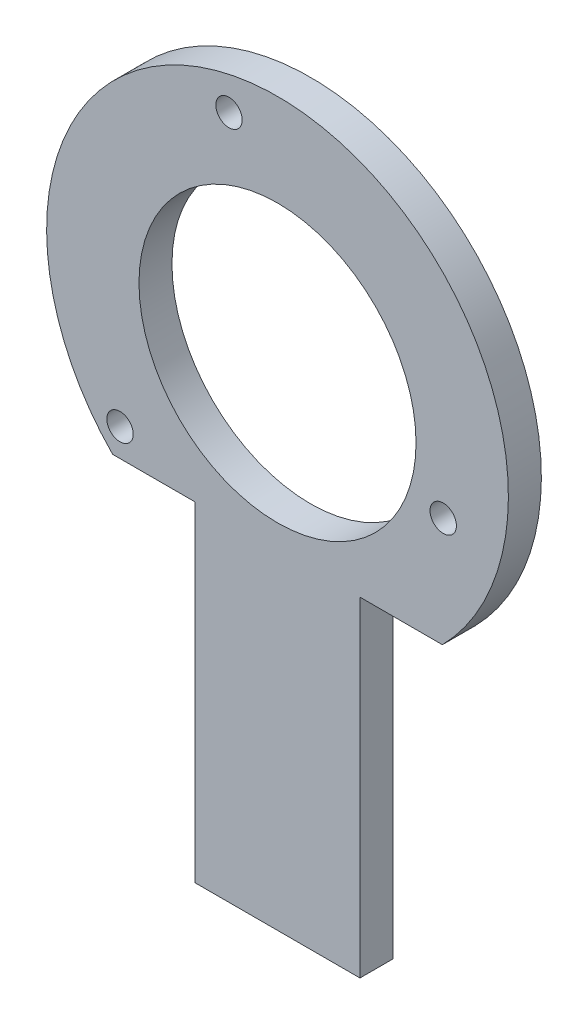
ISO-10303-21;
HEADER;
FILE_DESCRIPTION(('STEP AP214'),'2;1');
FILE_NAME('part.step','',(''),(''),'','','');
FILE_SCHEMA(('AUTOMOTIVE_DESIGN { 1 0 10303 214 1 1 1 1 }'));
ENDSEC;
DATA;
#1=APPLICATION_CONTEXT('core data for automotive mechanical design processes');
#2=APPLICATION_PROTOCOL_DEFINITION('international standard','automotive_design',2000,#1);
#3=PRODUCT_CONTEXT('',#1,'mechanical');
#4=PRODUCT('Part','Part','',(#3));
#5=PRODUCT_RELATED_PRODUCT_CATEGORY('part','',(#4));
#6=PRODUCT_DEFINITION_FORMATION('','',#4);
#7=PRODUCT_DEFINITION_CONTEXT('part definition',#1,'design');
#8=PRODUCT_DEFINITION('design','',#6,#7);
#9=PRODUCT_DEFINITION_SHAPE('','',#8);
#10=(LENGTH_UNIT() NAMED_UNIT(*) SI_UNIT(.MILLI.,.METRE.));
#11=(NAMED_UNIT(*) PLANE_ANGLE_UNIT() SI_UNIT($,.RADIAN.));
#12=(NAMED_UNIT(*) SI_UNIT($,.STERADIAN.) SOLID_ANGLE_UNIT());
#13=UNCERTAINTY_MEASURE_WITH_UNIT(LENGTH_MEASURE(1.E-05),#10,'distance_accuracy_value','');
#14=(GEOMETRIC_REPRESENTATION_CONTEXT(3) GLOBAL_UNCERTAINTY_ASSIGNED_CONTEXT((#13)) GLOBAL_UNIT_ASSIGNED_CONTEXT((#10,
#11,#12)) REPRESENTATION_CONTEXT('',''));
#15=CARTESIAN_POINT('',(0.,0.,0.));
#16=DIRECTION('',(0.,0.,1.));
#17=DIRECTION('',(1.,0.,0.));
#18=AXIS2_PLACEMENT_3D('',#15,#16,#17);
#19=CARTESIAN_POINT('',(-36.2560555223226,-24.892,0.));
#20=DIRECTION('',(0.,1.,0.));
#21=DIRECTION('',(0.,0.,1.));
#22=AXIS2_PLACEMENT_3D('',#19,#20,#21);
#23=PLANE('',#22);
#24=DIRECTION('',(0.,0.,1.));
#25=VECTOR('',#24,1.);
#26=CARTESIAN_POINT('',(12.7,-24.892,0.));
#27=LINE('',#26,#25);
#28=CARTESIAN_POINT('',(12.7,-24.892,0.));
#29=VERTEX_POINT('',#28);
#30=CARTESIAN_POINT('',(12.7,-24.892,5.08));
#31=VERTEX_POINT('',#30);
#32=EDGE_CURVE('E107',#29,#31,#27,.T.);
#33=ORIENTED_EDGE('',*,*,#32,.F.);
#34=DIRECTION('',(-1.,0.,0.));
#35=VECTOR('',#34,1.);
#36=CARTESIAN_POINT('',(0.,-24.8919999999999,0.));
#37=LINE('',#36,#35);
#38=CARTESIAN_POINT('',(25.3949194918984,-24.892,0.));
#39=VERTEX_POINT('',#38);
#40=EDGE_CURVE('E11',#39,#29,#37,.T.);
#41=ORIENTED_EDGE('',*,*,#40,.F.);
#42=DIRECTION('',(0.,0.,-1.));
#43=VECTOR('',#42,1.);
#44=CARTESIAN_POINT('',(25.3949194918984,-24.892,5.08));
#45=LINE('',#44,#43);
#46=CARTESIAN_POINT('',(25.3949194918984,-24.892,5.08));
#47=VERTEX_POINT('',#46);
#48=EDGE_CURVE('E143',#47,#39,#45,.T.);
#49=ORIENTED_EDGE('',*,*,#48,.F.);
#50=DIRECTION('',(-1.,0.,0.));
#51=VECTOR('',#50,1.);
#52=CARTESIAN_POINT('',(-36.2560555223226,-24.892,5.08));
#53=LINE('',#52,#51);
#54=EDGE_CURVE('E138',#47,#31,#53,.T.);
#55=ORIENTED_EDGE('',*,*,#54,.T.);
#56=EDGE_LOOP('',(#33,#41,#49,#55));
#57=FACE_BOUND('',#56,.T.);
#58=ADVANCED_FACE('F32',(#57),#23,.F.);
#59=DIRECTION('',(0.,0.,-1.));
#60=VECTOR('',#59,1.);
#61=CARTESIAN_POINT('',(-12.7,-24.892,0.));
#62=LINE('',#61,#60);
#63=CARTESIAN_POINT('',(-12.7,-24.892,5.08));
#64=VERTEX_POINT('',#63);
#65=CARTESIAN_POINT('',(-12.7,-24.892,0.));
#66=VERTEX_POINT('',#65);
#67=EDGE_CURVE('E103',#64,#66,#62,.T.);
#68=ORIENTED_EDGE('',*,*,#67,.F.);
#69=CARTESIAN_POINT('',(-25.3949194918984,-24.892,5.08));
#70=VERTEX_POINT('',#69);
#71=EDGE_CURVE('E123',#64,#70,#53,.T.);
#72=ORIENTED_EDGE('',*,*,#71,.T.);
#73=DIRECTION('',(0.,0.,-1.));
#74=VECTOR('',#73,1.);
#75=CARTESIAN_POINT('',(-25.3949194918984,-24.892,5.08));
#76=LINE('',#75,#74);
#77=CARTESIAN_POINT('',(-25.3949194918984,-24.892,0.));
#78=VERTEX_POINT('',#77);
#79=EDGE_CURVE('E140',#78,#70,#76,.F.);
#80=ORIENTED_EDGE('',*,*,#79,.F.);
#81=EDGE_CURVE('E40',#66,#78,#37,.T.);
#82=ORIENTED_EDGE('',*,*,#81,.F.);
#83=EDGE_LOOP('',(#68,#72,#80,#82));
#84=FACE_BOUND('',#83,.T.);
#85=ADVANCED_FACE('F164',(#84),#23,.F.);
#86=CARTESIAN_POINT('',(0.,0.,5.08));
#87=DIRECTION('',(0.,0.,-1.));
#88=DIRECTION('',(-1.,0.,0.));
#89=AXIS2_PLACEMENT_3D('',#86,#87,#88);
#90=CYLINDRICAL_SURFACE('',#89,35.56);
#91=CARTESIAN_POINT('',(0.,0.,5.08));
#92=DIRECTION('',(0.,0.,1.));
#93=DIRECTION('',(1.,0.,0.));
#94=AXIS2_PLACEMENT_3D('',#91,#92,#93);
#95=CIRCLE('',#94,35.56);
#96=EDGE_CURVE('E147',#47,#70,#95,.T.);
#97=ORIENTED_EDGE('',*,*,#96,.F.);
#98=ORIENTED_EDGE('',*,*,#48,.T.);
#99=CARTESIAN_POINT('',(0.,0.,0.));
#100=DIRECTION('',(0.,0.,1.));
#101=DIRECTION('',(1.,0.,0.));
#102=AXIS2_PLACEMENT_3D('',#99,#100,#101);
#103=CIRCLE('',#102,35.56);
#104=EDGE_CURVE('E146',#39,#78,#103,.T.);
#105=ORIENTED_EDGE('',*,*,#104,.T.);
#106=ORIENTED_EDGE('',*,*,#79,.T.);
#107=EDGE_LOOP('',(#97,#98,#105,#106));
#108=FACE_BOUND('',#107,.T.);
#109=ADVANCED_FACE('F34',(#108),#90,.T.);
#110=CARTESIAN_POINT('',(0.,0.,5.08));
#111=DIRECTION('',(0.,0.,1.));
#112=DIRECTION('',(1.,0.,0.));
#113=AXIS2_PLACEMENT_3D('',#110,#111,#112);
#114=PLANE('',#113);
#115=CARTESIAN_POINT('',(0.,0.,5.08));
#116=DIRECTION('',(0.,0.,-1.));
#117=DIRECTION('',(-1.,0.,0.));
#118=AXIS2_PLACEMENT_3D('',#115,#116,#117);
#119=CIRCLE('',#118,21.336);
#120=CARTESIAN_POINT('',(-21.336,0.,5.08));
#121=VERTEX_POINT('',#120);
#122=EDGE_CURVE('E112',#121,#121,#119,.T.);
#123=ORIENTED_EDGE('',*,*,#122,.T.);
#124=EDGE_LOOP('',(#123));
#125=FACE_BOUND('',#124,.T.);
#126=CARTESIAN_POINT('',(-24.2610998869317,-20.6264765028923,5.08));
#127=DIRECTION('',(0.,0.,1.));
#128=DIRECTION('',(1.,0.,0.));
#129=AXIS2_PLACEMENT_3D('',#126,#127,#128);
#130=CIRCLE('',#129,2.032);
#131=CARTESIAN_POINT('',(-22.2290998869317,-20.6264765028923,5.08));
#132=VERTEX_POINT('',#131);
#133=EDGE_CURVE('E124',#132,#132,#130,.T.);
#134=ORIENTED_EDGE('',*,*,#133,.F.);
#135=EDGE_LOOP('',(#134));
#136=FACE_BOUND('',#135,.T.);
#137=CARTESIAN_POINT('',(-7.47196911393405,29.6655234971076,5.08));
#138=DIRECTION('',(0.,0.,1.));
#139=DIRECTION('',(1.,0.,0.));
#140=AXIS2_PLACEMENT_3D('',#137,#138,#139);
#141=CIRCLE('',#140,2.032);
#142=CARTESIAN_POINT('',(-5.43996911393405,29.6655234971076,5.08));
#143=VERTEX_POINT('',#142);
#144=EDGE_CURVE('E130',#143,#143,#141,.T.);
#145=ORIENTED_EDGE('',*,*,#144,.F.);
#146=EDGE_LOOP('',(#145));
#147=FACE_BOUND('',#146,.T.);
#148=CARTESIAN_POINT('',(25.5229001130682,-7.95282373789202,5.08));
#149=DIRECTION('',(0.,0.,1.));
#150=DIRECTION('',(1.,0.,0.));
#151=AXIS2_PLACEMENT_3D('',#148,#149,#150);
#152=CIRCLE('',#151,2.032);
#153=CARTESIAN_POINT('',(27.5549001130682,-7.95282373789202,5.08));
#154=VERTEX_POINT('',#153);
#155=EDGE_CURVE('E118',#154,#154,#152,.T.);
#156=ORIENTED_EDGE('',*,*,#155,.F.);
#157=EDGE_LOOP('',(#156));
#158=FACE_BOUND('',#157,.T.);
#159=ORIENTED_EDGE('',*,*,#54,.F.);
#160=ORIENTED_EDGE('',*,*,#96,.T.);
#161=ORIENTED_EDGE('',*,*,#71,.F.);
#162=DIRECTION('',(0.,1.,0.));
#163=VECTOR('',#162,1.);
#164=CARTESIAN_POINT('',(-12.7,-75.692,5.08));
#165=LINE('',#164,#163);
#166=CARTESIAN_POINT('',(-12.7,-75.692,5.08));
#167=VERTEX_POINT('',#166);
#168=EDGE_CURVE('E92',#167,#64,#165,.T.);
#169=ORIENTED_EDGE('',*,*,#168,.F.);
#170=DIRECTION('',(-1.,0.,0.));
#171=VECTOR('',#170,1.);
#172=CARTESIAN_POINT('',(-12.7,-75.692,5.08));
#173=LINE('',#172,#171);
#174=CARTESIAN_POINT('',(12.7,-75.692,5.08));
#175=VERTEX_POINT('',#174);
#176=EDGE_CURVE('E84',#175,#167,#173,.T.);
#177=ORIENTED_EDGE('',*,*,#176,.F.);
#178=DIRECTION('',(0.,1.,0.));
#179=VECTOR('',#178,1.);
#180=CARTESIAN_POINT('',(12.7,-75.692,5.08));
#181=LINE('',#180,#179);
#182=EDGE_CURVE('E89',#175,#31,#181,.T.);
#183=ORIENTED_EDGE('',*,*,#182,.T.);
#184=EDGE_LOOP('',(#159,#160,#161,#169,#177,#183));
#185=FACE_BOUND('',#184,.T.);
#186=ADVANCED_FACE('F87',(#125,#136,#147,#158,#185),#114,.T.);
#187=CARTESIAN_POINT('',(0.,0.,0.));
#188=DIRECTION('',(0.,0.,1.));
#189=DIRECTION('',(1.,0.,0.));
#190=AXIS2_PLACEMENT_3D('',#187,#188,#189);
#191=PLANE('',#190);
#192=CARTESIAN_POINT('',(0.,0.,0.));
#193=DIRECTION('',(0.,0.,-1.));
#194=DIRECTION('',(-1.,0.,0.));
#195=AXIS2_PLACEMENT_3D('',#192,#193,#194);
#196=CIRCLE('',#195,21.336);
#197=CARTESIAN_POINT('',(-21.336,0.,0.));
#198=VERTEX_POINT('',#197);
#199=EDGE_CURVE('E109',#198,#198,#196,.T.);
#200=ORIENTED_EDGE('',*,*,#199,.F.);
#201=EDGE_LOOP('',(#200));
#202=FACE_BOUND('',#201,.T.);
#203=CARTESIAN_POINT('',(-24.2610998869317,-20.6264765028923,0.));
#204=DIRECTION('',(0.,0.,1.));
#205=DIRECTION('',(1.,0.,0.));
#206=AXIS2_PLACEMENT_3D('',#203,#204,#205);
#207=CIRCLE('',#206,2.032);
#208=CARTESIAN_POINT('',(-22.2290998869317,-20.6264765028923,0.));
#209=VERTEX_POINT('',#208);
#210=EDGE_CURVE('E120',#209,#209,#207,.T.);
#211=ORIENTED_EDGE('',*,*,#210,.T.);
#212=EDGE_LOOP('',(#211));
#213=FACE_BOUND('',#212,.T.);
#214=CARTESIAN_POINT('',(-7.47196911393405,29.6655234971076,0.));
#215=DIRECTION('',(0.,0.,1.));
#216=DIRECTION('',(1.,0.,0.));
#217=AXIS2_PLACEMENT_3D('',#214,#215,#216);
#218=CIRCLE('',#217,2.032);
#219=CARTESIAN_POINT('',(-5.43996911393405,29.6655234971076,0.));
#220=VERTEX_POINT('',#219);
#221=EDGE_CURVE('E127',#220,#220,#218,.T.);
#222=ORIENTED_EDGE('',*,*,#221,.T.);
#223=EDGE_LOOP('',(#222));
#224=FACE_BOUND('',#223,.T.);
#225=CARTESIAN_POINT('',(25.5229001130682,-7.95282373789202,0.));
#226=DIRECTION('',(0.,0.,1.));
#227=DIRECTION('',(1.,0.,0.));
#228=AXIS2_PLACEMENT_3D('',#225,#226,#227);
#229=CIRCLE('',#228,2.032);
#230=CARTESIAN_POINT('',(27.5549001130682,-7.95282373789202,0.));
#231=VERTEX_POINT('',#230);
#232=EDGE_CURVE('E133',#231,#231,#229,.T.);
#233=ORIENTED_EDGE('',*,*,#232,.T.);
#234=EDGE_LOOP('',(#233));
#235=FACE_BOUND('',#234,.T.);
#236=ORIENTED_EDGE('',*,*,#104,.F.);
#237=ORIENTED_EDGE('',*,*,#40,.T.);
#238=DIRECTION('',(0.,1.,0.));
#239=VECTOR('',#238,1.);
#240=CARTESIAN_POINT('',(12.7,-75.692,0.));
#241=LINE('',#240,#239);
#242=CARTESIAN_POINT('',(12.7,-75.692,0.));
#243=VERTEX_POINT('',#242);
#244=EDGE_CURVE('E153',#243,#29,#241,.T.);
#245=ORIENTED_EDGE('',*,*,#244,.F.);
#246=DIRECTION('',(1.,0.,0.));
#247=VECTOR('',#246,1.);
#248=CARTESIAN_POINT('',(-12.7,-75.692,0.));
#249=LINE('',#248,#247);
#250=CARTESIAN_POINT('',(-12.7,-75.692,0.));
#251=VERTEX_POINT('',#250);
#252=EDGE_CURVE('E100',#251,#243,#249,.T.);
#253=ORIENTED_EDGE('',*,*,#252,.F.);
#254=DIRECTION('',(0.,1.,0.));
#255=VECTOR('',#254,1.);
#256=CARTESIAN_POINT('',(-12.7,-75.692,0.));
#257=LINE('',#256,#255);
#258=EDGE_CURVE('E47',#251,#66,#257,.T.);
#259=ORIENTED_EDGE('',*,*,#258,.T.);
#260=ORIENTED_EDGE('',*,*,#81,.T.);
#261=EDGE_LOOP('',(#236,#237,#245,#253,#259,#260));
#262=FACE_BOUND('',#261,.T.);
#263=ADVANCED_FACE('F152',(#202,#213,#224,#235,#262),#191,.F.);
#264=CARTESIAN_POINT('',(25.5229001130682,-7.95282373789202,0.));
#265=DIRECTION('',(0.,0.,1.));
#266=DIRECTION('',(1.,0.,0.));
#267=AXIS2_PLACEMENT_3D('',#264,#265,#266);
#268=CYLINDRICAL_SURFACE('',#267,2.032);
#269=ORIENTED_EDGE('',*,*,#232,.F.);
#270=EDGE_LOOP('',(#269));
#271=FACE_BOUND('',#270,.T.);
#272=ORIENTED_EDGE('',*,*,#155,.T.);
#273=EDGE_LOOP('',(#272));
#274=FACE_BOUND('',#273,.T.);
#275=ADVANCED_FACE('F173',(#271,#274),#268,.F.);
#276=CARTESIAN_POINT('',(-7.47196911393405,29.6655234971076,0.));
#277=DIRECTION('',(0.,0.,1.));
#278=DIRECTION('',(1.,0.,0.));
#279=AXIS2_PLACEMENT_3D('',#276,#277,#278);
#280=CYLINDRICAL_SURFACE('',#279,2.032);
#281=ORIENTED_EDGE('',*,*,#221,.F.);
#282=EDGE_LOOP('',(#281));
#283=FACE_BOUND('',#282,.T.);
#284=ORIENTED_EDGE('',*,*,#144,.T.);
#285=EDGE_LOOP('',(#284));
#286=FACE_BOUND('',#285,.T.);
#287=ADVANCED_FACE('F182',(#283,#286),#280,.F.);
#288=CARTESIAN_POINT('',(-24.2610998869317,-20.6264765028923,0.));
#289=DIRECTION('',(0.,0.,1.));
#290=DIRECTION('',(1.,0.,0.));
#291=AXIS2_PLACEMENT_3D('',#288,#289,#290);
#292=CYLINDRICAL_SURFACE('',#291,2.032);
#293=ORIENTED_EDGE('',*,*,#210,.F.);
#294=EDGE_LOOP('',(#293));
#295=FACE_BOUND('',#294,.T.);
#296=ORIENTED_EDGE('',*,*,#133,.T.);
#297=EDGE_LOOP('',(#296));
#298=FACE_BOUND('',#297,.T.);
#299=ADVANCED_FACE('F197',(#295,#298),#292,.F.);
#300=CARTESIAN_POINT('',(0.,0.,5.08));
#301=DIRECTION('',(0.,0.,-1.));
#302=DIRECTION('',(-1.,0.,0.));
#303=AXIS2_PLACEMENT_3D('',#300,#301,#302);
#304=CYLINDRICAL_SURFACE('',#303,21.336);
#305=ORIENTED_EDGE('',*,*,#122,.F.);
#306=EDGE_LOOP('',(#305));
#307=FACE_BOUND('',#306,.T.);
#308=ORIENTED_EDGE('',*,*,#199,.T.);
#309=EDGE_LOOP('',(#308));
#310=FACE_BOUND('',#309,.T.);
#311=ADVANCED_FACE('F203',(#307,#310),#304,.F.);
#312=CARTESIAN_POINT('',(12.7,-75.692,0.));
#313=DIRECTION('',(-1.,0.,0.));
#314=DIRECTION('',(0.,0.,1.));
#315=AXIS2_PLACEMENT_3D('',#312,#313,#314);
#316=PLANE('',#315);
#317=ORIENTED_EDGE('',*,*,#32,.T.);
#318=ORIENTED_EDGE('',*,*,#182,.F.);
#319=DIRECTION('',(0.,0.,1.));
#320=VECTOR('',#319,1.);
#321=CARTESIAN_POINT('',(12.7,-75.692,0.));
#322=LINE('',#321,#320);
#323=EDGE_CURVE('E96',#243,#175,#322,.T.);
#324=ORIENTED_EDGE('',*,*,#323,.F.);
#325=ORIENTED_EDGE('',*,*,#244,.T.);
#326=EDGE_LOOP('',(#317,#318,#324,#325));
#327=FACE_BOUND('',#326,.T.);
#328=ADVANCED_FACE('F105',(#327),#316,.F.);
#329=CARTESIAN_POINT('',(-12.7,-75.692,0.));
#330=DIRECTION('',(1.,0.,0.));
#331=DIRECTION('',(0.,0.,-1.));
#332=AXIS2_PLACEMENT_3D('',#329,#330,#331);
#333=PLANE('',#332);
#334=ORIENTED_EDGE('',*,*,#67,.T.);
#335=ORIENTED_EDGE('',*,*,#258,.F.);
#336=DIRECTION('',(0.,0.,-1.));
#337=VECTOR('',#336,1.);
#338=CARTESIAN_POINT('',(-12.7,-75.692,0.));
#339=LINE('',#338,#337);
#340=EDGE_CURVE('E95',#167,#251,#339,.T.);
#341=ORIENTED_EDGE('',*,*,#340,.F.);
#342=ORIENTED_EDGE('',*,*,#168,.T.);
#343=EDGE_LOOP('',(#334,#335,#341,#342));
#344=FACE_BOUND('',#343,.T.);
#345=ADVANCED_FACE('F161',(#344),#333,.F.);
#346=CARTESIAN_POINT('',(0.,-75.692,0.));
#347=DIRECTION('',(0.,1.,0.));
#348=DIRECTION('',(0.,0.,1.));
#349=AXIS2_PLACEMENT_3D('',#346,#347,#348);
#350=PLANE('',#349);
#351=ORIENTED_EDGE('',*,*,#323,.T.);
#352=ORIENTED_EDGE('',*,*,#176,.T.);
#353=ORIENTED_EDGE('',*,*,#340,.T.);
#354=ORIENTED_EDGE('',*,*,#252,.T.);
#355=EDGE_LOOP('',(#351,#352,#353,#354));
#356=FACE_BOUND('',#355,.T.);
#357=ADVANCED_FACE('F99',(#356),#350,.F.);
#358=CLOSED_SHELL('',(#58,#85,#109,#186,#263,#275,#287,#299,#311,#328,#345,#357));
#359=MANIFOLD_SOLID_BREP('B2',#358);
#360=ADVANCED_BREP_SHAPE_REPRESENTATION('',(#18,#359),#14);
#361=SHAPE_DEFINITION_REPRESENTATION(#9,#360);
ENDSEC;
END-ISO-10303-21;
